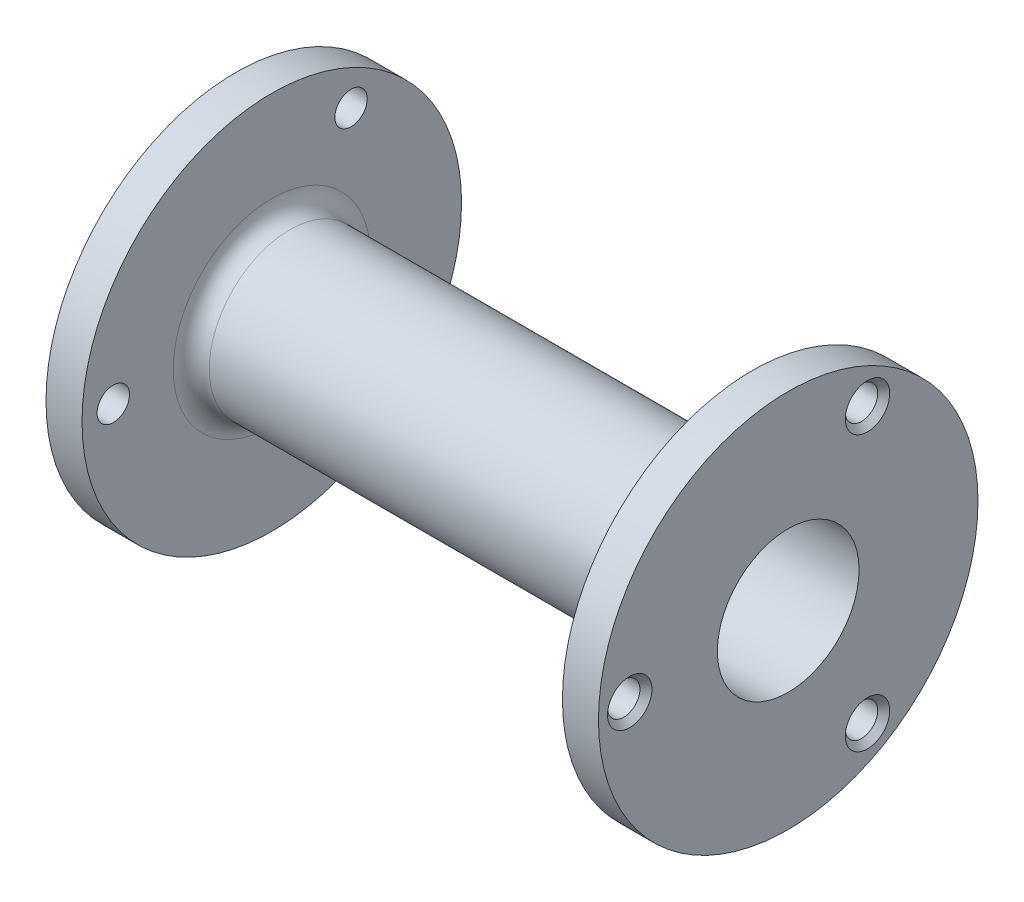
ISO-10303-21;
HEADER;
FILE_DESCRIPTION(('STEP AP214'),'2;1');
FILE_NAME('part.step','',(''),(''),'','','');
FILE_SCHEMA(('AUTOMOTIVE_DESIGN { 1 0 10303 214 1 1 1 1 }'));
ENDSEC;
DATA;
#1=APPLICATION_CONTEXT('core data for automotive mechanical design processes');
#2=APPLICATION_PROTOCOL_DEFINITION('international standard','automotive_design',2000,#1);
#3=PRODUCT_CONTEXT('',#1,'mechanical');
#4=PRODUCT('Part','Part','',(#3));
#5=PRODUCT_RELATED_PRODUCT_CATEGORY('part','',(#4));
#6=PRODUCT_DEFINITION_FORMATION('','',#4);
#7=PRODUCT_DEFINITION_CONTEXT('part definition',#1,'design');
#8=PRODUCT_DEFINITION('design','',#6,#7);
#9=PRODUCT_DEFINITION_SHAPE('','',#8);
#10=(LENGTH_UNIT() NAMED_UNIT(*) SI_UNIT(.MILLI.,.METRE.));
#11=(NAMED_UNIT(*) PLANE_ANGLE_UNIT() SI_UNIT($,.RADIAN.));
#12=(NAMED_UNIT(*) SI_UNIT($,.STERADIAN.) SOLID_ANGLE_UNIT());
#13=UNCERTAINTY_MEASURE_WITH_UNIT(LENGTH_MEASURE(1.E-05),#10,'distance_accuracy_value','');
#14=(GEOMETRIC_REPRESENTATION_CONTEXT(3) GLOBAL_UNCERTAINTY_ASSIGNED_CONTEXT((#13)) GLOBAL_UNIT_ASSIGNED_CONTEXT((#10,
#11,#12)) REPRESENTATION_CONTEXT('',''));
#15=CARTESIAN_POINT('',(0.,0.,0.));
#16=DIRECTION('',(0.,0.,1.));
#17=DIRECTION('',(1.,0.,0.));
#18=AXIS2_PLACEMENT_3D('',#15,#16,#17);
#19=CARTESIAN_POINT('',(0.,0.,0.));
#20=DIRECTION('',(1.,0.,0.));
#21=DIRECTION('',(0.,0.,-1.));
#22=AXIS2_PLACEMENT_3D('',#19,#20,#21);
#23=CYLINDRICAL_SURFACE('',#22,15.8);
#24=CARTESIAN_POINT('',(0.,0.,0.));
#25=DIRECTION('',(1.,0.,0.));
#26=DIRECTION('',(0.,0.,-1.));
#27=AXIS2_PLACEMENT_3D('',#24,#25,#26);
#28=CIRCLE('',#27,15.8);
#29=CARTESIAN_POINT('',(0.,0.,-15.8));
#30=VERTEX_POINT('',#29);
#31=EDGE_CURVE('E104',#30,#30,#28,.T.);
#32=ORIENTED_EDGE('',*,*,#31,.T.);
#33=EDGE_LOOP('',(#32));
#34=FACE_BOUND('',#33,.T.);
#35=CARTESIAN_POINT('',(3.,0.,0.));
#36=DIRECTION('',(1.,0.,0.));
#37=DIRECTION('',(0.,0.,-1.));
#38=AXIS2_PLACEMENT_3D('',#35,#36,#37);
#39=CIRCLE('',#38,15.8);
#40=CARTESIAN_POINT('',(3.,0.,-15.8));
#41=VERTEX_POINT('',#40);
#42=EDGE_CURVE('E77',#41,#41,#39,.T.);
#43=ORIENTED_EDGE('',*,*,#42,.F.);
#44=EDGE_LOOP('',(#43));
#45=FACE_BOUND('',#44,.T.);
#46=ADVANCED_FACE('F33',(#34,#45),#23,.T.);
#47=CARTESIAN_POINT('',(3.,15.8,0.));
#48=DIRECTION('',(1.,0.,0.));
#49=DIRECTION('',(0.,0.,-1.));
#50=AXIS2_PLACEMENT_3D('',#47,#48,#49);
#51=PLANE('',#50);
#52=CARTESIAN_POINT('',(3.,0.,13.2));
#53=DIRECTION('',(1.,0.,0.));
#54=DIRECTION('',(0.,0.,-1.));
#55=AXIS2_PLACEMENT_3D('',#52,#53,#54);
#56=CIRCLE('',#55,1.35);
#57=CARTESIAN_POINT('',(3.,0.,11.85));
#58=VERTEX_POINT('',#57);
#59=EDGE_CURVE('E107',#58,#58,#56,.T.);
#60=ORIENTED_EDGE('',*,*,#59,.F.);
#61=EDGE_LOOP('',(#60));
#62=FACE_BOUND('',#61,.T.);
#63=CARTESIAN_POINT('',(3.,11.4315353299546,-6.60000000000007));
#64=DIRECTION('',(1.,0.,0.));
#65=DIRECTION('',(0.,0.,-1.));
#66=AXIS2_PLACEMENT_3D('',#63,#64,#65);
#67=CIRCLE('',#66,1.35);
#68=CARTESIAN_POINT('',(3.,11.4315353299546,-7.95000000000007));
#69=VERTEX_POINT('',#68);
#70=EDGE_CURVE('E113',#69,#69,#67,.T.);
#71=ORIENTED_EDGE('',*,*,#70,.F.);
#72=EDGE_LOOP('',(#71));
#73=FACE_BOUND('',#72,.T.);
#74=CARTESIAN_POINT('',(3.,-11.4315353299547,-6.60000000000001));
#75=DIRECTION('',(1.,0.,0.));
#76=DIRECTION('',(0.,0.,-1.));
#77=AXIS2_PLACEMENT_3D('',#74,#75,#76);
#78=CIRCLE('',#77,1.35);
#79=CARTESIAN_POINT('',(3.,-11.4315353299547,-7.95000000000001));
#80=VERTEX_POINT('',#79);
#81=EDGE_CURVE('E119',#80,#80,#78,.T.);
#82=ORIENTED_EDGE('',*,*,#81,.F.);
#83=EDGE_LOOP('',(#82));
#84=FACE_BOUND('',#83,.T.);
#85=ORIENTED_EDGE('',*,*,#42,.T.);
#86=EDGE_LOOP('',(#85));
#87=FACE_BOUND('',#86,.T.);
#88=CARTESIAN_POINT('',(3.,0.,0.));
#89=DIRECTION('',(1.,0.,0.));
#90=DIRECTION('',(0.,0.,-1.));
#91=AXIS2_PLACEMENT_3D('',#88,#89,#90);
#92=CIRCLE('',#91,8.21);
#93=CARTESIAN_POINT('',(3.,0.,-8.21));
#94=VERTEX_POINT('',#93);
#95=EDGE_CURVE('E80',#94,#94,#92,.T.);
#96=ORIENTED_EDGE('',*,*,#95,.F.);
#97=EDGE_LOOP('',(#96));
#98=FACE_BOUND('',#97,.T.);
#99=ADVANCED_FACE('F167',(#62,#73,#84,#87,#98),#51,.T.);
#100=CARTESIAN_POINT('',(4.5,0.,0.));
#101=DIRECTION('',(1.,0.,0.));
#102=DIRECTION('',(0.,0.,-1.));
#103=AXIS2_PLACEMENT_3D('',#100,#101,#102);
#104=TOROIDAL_SURFACE('',#103,8.21,1.5);
#105=ORIENTED_EDGE('',*,*,#95,.T.);
#106=EDGE_LOOP('',(#105));
#107=FACE_BOUND('',#106,.T.);
#108=CARTESIAN_POINT('',(4.5,0.,0.));
#109=DIRECTION('',(1.,0.,0.));
#110=DIRECTION('',(0.,0.,-1.));
#111=AXIS2_PLACEMENT_3D('',#108,#109,#110);
#112=CIRCLE('',#111,6.71);
#113=CARTESIAN_POINT('',(4.5,0.,-6.71));
#114=VERTEX_POINT('',#113);
#115=EDGE_CURVE('E83',#114,#114,#112,.T.);
#116=ORIENTED_EDGE('',*,*,#115,.F.);
#117=EDGE_LOOP('',(#116));
#118=FACE_BOUND('',#117,.T.);
#119=ADVANCED_FACE('F173',(#107,#118),#104,.F.);
#120=CARTESIAN_POINT('',(0.,0.,0.));
#121=DIRECTION('',(1.,0.,0.));
#122=DIRECTION('',(0.,0.,-1.));
#123=AXIS2_PLACEMENT_3D('',#120,#121,#122);
#124=CYLINDRICAL_SURFACE('',#123,6.71);
#125=ORIENTED_EDGE('',*,*,#115,.T.);
#126=EDGE_LOOP('',(#125));
#127=FACE_BOUND('',#126,.T.);
#128=CARTESIAN_POINT('',(41.5,0.,0.));
#129=DIRECTION('',(1.,0.,0.));
#130=DIRECTION('',(0.,0.,-1.));
#131=AXIS2_PLACEMENT_3D('',#128,#129,#130);
#132=CIRCLE('',#131,6.71);
#133=CARTESIAN_POINT('',(41.5,0.,-6.71));
#134=VERTEX_POINT('',#133);
#135=EDGE_CURVE('E86',#134,#134,#132,.T.);
#136=ORIENTED_EDGE('',*,*,#135,.F.);
#137=EDGE_LOOP('',(#136));
#138=FACE_BOUND('',#137,.T.);
#139=ADVANCED_FACE('F180',(#127,#138),#124,.T.);
#140=CARTESIAN_POINT('',(41.5,0.,0.));
#141=DIRECTION('',(1.,0.,0.));
#142=DIRECTION('',(0.,0.,-1.));
#143=AXIS2_PLACEMENT_3D('',#140,#141,#142);
#144=TOROIDAL_SURFACE('',#143,8.21,1.5);
#145=ORIENTED_EDGE('',*,*,#135,.T.);
#146=EDGE_LOOP('',(#145));
#147=FACE_BOUND('',#146,.T.);
#148=CARTESIAN_POINT('',(43.,0.,0.));
#149=DIRECTION('',(1.,0.,0.));
#150=DIRECTION('',(0.,0.,-1.));
#151=AXIS2_PLACEMENT_3D('',#148,#149,#150);
#152=CIRCLE('',#151,8.21);
#153=CARTESIAN_POINT('',(43.,0.,-8.21));
#154=VERTEX_POINT('',#153);
#155=EDGE_CURVE('E89',#154,#154,#152,.T.);
#156=ORIENTED_EDGE('',*,*,#155,.F.);
#157=EDGE_LOOP('',(#156));
#158=FACE_BOUND('',#157,.T.);
#159=ADVANCED_FACE('F132',(#147,#158),#144,.F.);
#160=CARTESIAN_POINT('',(43.,8.21,0.));
#161=DIRECTION('',(-1.,0.,0.));
#162=DIRECTION('',(0.,0.,1.));
#163=AXIS2_PLACEMENT_3D('',#160,#161,#162);
#164=PLANE('',#163);
#165=CARTESIAN_POINT('',(43.,0.,13.2));
#166=DIRECTION('',(-1.,0.,0.));
#167=DIRECTION('',(0.,0.,1.));
#168=AXIS2_PLACEMENT_3D('',#165,#166,#167);
#169=CIRCLE('',#168,1.35);
#170=CARTESIAN_POINT('',(43.,0.,14.55));
#171=VERTEX_POINT('',#170);
#172=EDGE_CURVE('E110',#171,#171,#169,.T.);
#173=ORIENTED_EDGE('',*,*,#172,.F.);
#174=EDGE_LOOP('',(#173));
#175=FACE_BOUND('',#174,.T.);
#176=CARTESIAN_POINT('',(43.,11.4315353299546,-6.60000000000007));
#177=DIRECTION('',(-1.,0.,0.));
#178=DIRECTION('',(0.,0.,1.));
#179=AXIS2_PLACEMENT_3D('',#176,#177,#178);
#180=CIRCLE('',#179,1.35);
#181=CARTESIAN_POINT('',(43.,11.4315353299546,-5.25000000000007));
#182=VERTEX_POINT('',#181);
#183=EDGE_CURVE('E116',#182,#182,#180,.T.);
#184=ORIENTED_EDGE('',*,*,#183,.F.);
#185=EDGE_LOOP('',(#184));
#186=FACE_BOUND('',#185,.T.);
#187=CARTESIAN_POINT('',(43.,-11.4315353299547,-6.60000000000001));
#188=DIRECTION('',(-1.,0.,0.));
#189=DIRECTION('',(0.,0.,1.));
#190=AXIS2_PLACEMENT_3D('',#187,#188,#189);
#191=CIRCLE('',#190,1.35);
#192=CARTESIAN_POINT('',(43.,-11.4315353299547,-5.25000000000002));
#193=VERTEX_POINT('',#192);
#194=EDGE_CURVE('E122',#193,#193,#191,.T.);
#195=ORIENTED_EDGE('',*,*,#194,.F.);
#196=EDGE_LOOP('',(#195));
#197=FACE_BOUND('',#196,.T.);
#198=ORIENTED_EDGE('',*,*,#155,.T.);
#199=EDGE_LOOP('',(#198));
#200=FACE_BOUND('',#199,.T.);
#201=CARTESIAN_POINT('',(43.,0.,0.));
#202=DIRECTION('',(1.,0.,0.));
#203=DIRECTION('',(0.,0.,-1.));
#204=AXIS2_PLACEMENT_3D('',#201,#202,#203);
#205=CIRCLE('',#204,15.8);
#206=CARTESIAN_POINT('',(43.,0.,-15.8));
#207=VERTEX_POINT('',#206);
#208=EDGE_CURVE('E92',#207,#207,#205,.T.);
#209=ORIENTED_EDGE('',*,*,#208,.F.);
#210=EDGE_LOOP('',(#209));
#211=FACE_BOUND('',#210,.T.);
#212=ADVANCED_FACE('F128',(#175,#186,#197,#200,#211),#164,.T.);
#213=CARTESIAN_POINT('',(0.,0.,0.));
#214=DIRECTION('',(1.,0.,0.));
#215=DIRECTION('',(0.,0.,-1.));
#216=AXIS2_PLACEMENT_3D('',#213,#214,#215);
#217=CYLINDRICAL_SURFACE('',#216,15.8);
#218=ORIENTED_EDGE('',*,*,#208,.T.);
#219=EDGE_LOOP('',(#218));
#220=FACE_BOUND('',#219,.T.);
#221=CARTESIAN_POINT('',(46.,0.,0.));
#222=DIRECTION('',(1.,0.,0.));
#223=DIRECTION('',(0.,0.,-1.));
#224=AXIS2_PLACEMENT_3D('',#221,#222,#223);
#225=CIRCLE('',#224,15.8);
#226=CARTESIAN_POINT('',(46.,0.,-15.8));
#227=VERTEX_POINT('',#226);
#228=EDGE_CURVE('E95',#227,#227,#225,.T.);
#229=ORIENTED_EDGE('',*,*,#228,.F.);
#230=EDGE_LOOP('',(#229));
#231=FACE_BOUND('',#230,.T.);
#232=ADVANCED_FACE('F131',(#220,#231),#217,.T.);
#233=CARTESIAN_POINT('',(46.,15.8,0.));
#234=DIRECTION('',(1.,0.,0.));
#235=DIRECTION('',(0.,0.,-1.));
#236=AXIS2_PLACEMENT_3D('',#233,#234,#235);
#237=PLANE('',#236);
#238=CARTESIAN_POINT('',(46.,0.,13.2));
#239=DIRECTION('',(1.,0.,0.));
#240=DIRECTION('',(0.,0.,-1.));
#241=AXIS2_PLACEMENT_3D('',#238,#239,#240);
#242=CIRCLE('',#241,1.85000000000001);
#243=CARTESIAN_POINT('',(46.,0.,11.35));
#244=VERTEX_POINT('',#243);
#245=EDGE_CURVE('E44',#244,#244,#242,.F.);
#246=ORIENTED_EDGE('',*,*,#245,.T.);
#247=EDGE_LOOP('',(#246));
#248=FACE_BOUND('',#247,.T.);
#249=CARTESIAN_POINT('',(46.,-11.4315353299547,-6.60000000000001));
#250=DIRECTION('',(1.,0.,0.));
#251=DIRECTION('',(0.,0.,-1.));
#252=AXIS2_PLACEMENT_3D('',#249,#250,#251);
#253=CIRCLE('',#252,1.85);
#254=CARTESIAN_POINT('',(46.,-11.4315353299547,-8.45000000000002));
#255=VERTEX_POINT('',#254);
#256=EDGE_CURVE('E48',#255,#255,#253,.F.);
#257=ORIENTED_EDGE('',*,*,#256,.T.);
#258=EDGE_LOOP('',(#257));
#259=FACE_BOUND('',#258,.T.);
#260=CARTESIAN_POINT('',(46.,11.4315353299546,-6.60000000000007));
#261=DIRECTION('',(1.,0.,0.));
#262=DIRECTION('',(0.,0.,-1.));
#263=AXIS2_PLACEMENT_3D('',#260,#261,#262);
#264=CIRCLE('',#263,1.85);
#265=CARTESIAN_POINT('',(46.,11.4315353299546,-8.45000000000007));
#266=VERTEX_POINT('',#265);
#267=EDGE_CURVE('E53',#266,#266,#264,.F.);
#268=ORIENTED_EDGE('',*,*,#267,.T.);
#269=EDGE_LOOP('',(#268));
#270=FACE_BOUND('',#269,.T.);
#271=ORIENTED_EDGE('',*,*,#228,.T.);
#272=EDGE_LOOP('',(#271));
#273=FACE_BOUND('',#272,.T.);
#274=CARTESIAN_POINT('',(46.,0.,0.));
#275=DIRECTION('',(1.,0.,0.));
#276=DIRECTION('',(0.,0.,-1.));
#277=AXIS2_PLACEMENT_3D('',#274,#275,#276);
#278=CIRCLE('',#277,5.9);
#279=CARTESIAN_POINT('',(46.,0.,-5.9));
#280=VERTEX_POINT('',#279);
#281=EDGE_CURVE('E98',#280,#280,#278,.T.);
#282=ORIENTED_EDGE('',*,*,#281,.F.);
#283=EDGE_LOOP('',(#282));
#284=FACE_BOUND('',#283,.T.);
#285=ADVANCED_FACE('F141',(#248,#259,#270,#273,#284),#237,.T.);
#286=CARTESIAN_POINT('',(0.,0.,0.));
#287=DIRECTION('',(1.,0.,0.));
#288=DIRECTION('',(0.,0.,-1.));
#289=AXIS2_PLACEMENT_3D('',#286,#287,#288);
#290=CYLINDRICAL_SURFACE('',#289,5.9);
#291=ORIENTED_EDGE('',*,*,#281,.T.);
#292=EDGE_LOOP('',(#291));
#293=FACE_BOUND('',#292,.T.);
#294=CARTESIAN_POINT('',(0.,0.,0.));
#295=DIRECTION('',(1.,0.,0.));
#296=DIRECTION('',(0.,0.,-1.));
#297=AXIS2_PLACEMENT_3D('',#294,#295,#296);
#298=CIRCLE('',#297,5.9);
#299=CARTESIAN_POINT('',(0.,0.,-5.9));
#300=VERTEX_POINT('',#299);
#301=EDGE_CURVE('E101',#300,#300,#298,.T.);
#302=ORIENTED_EDGE('',*,*,#301,.F.);
#303=EDGE_LOOP('',(#302));
#304=FACE_BOUND('',#303,.T.);
#305=ADVANCED_FACE('F147',(#293,#304),#290,.F.);
#306=CARTESIAN_POINT('',(0.,5.9,0.));
#307=DIRECTION('',(-1.,0.,0.));
#308=DIRECTION('',(0.,0.,1.));
#309=AXIS2_PLACEMENT_3D('',#306,#307,#308);
#310=PLANE('',#309);
#311=CARTESIAN_POINT('',(0.,-11.4315353299547,-6.60000000000001));
#312=DIRECTION('',(-1.,0.,0.));
#313=DIRECTION('',(0.,0.,1.));
#314=AXIS2_PLACEMENT_3D('',#311,#312,#313);
#315=CIRCLE('',#314,1.84999999999999);
#316=CARTESIAN_POINT('',(0.,-11.4315353299547,-4.75000000000002));
#317=VERTEX_POINT('',#316);
#318=EDGE_CURVE('E68',#317,#317,#315,.F.);
#319=ORIENTED_EDGE('',*,*,#318,.T.);
#320=EDGE_LOOP('',(#319));
#321=FACE_BOUND('',#320,.T.);
#322=CARTESIAN_POINT('',(0.,11.4315353299546,-6.60000000000007));
#323=DIRECTION('',(-1.,0.,0.));
#324=DIRECTION('',(0.,0.,1.));
#325=AXIS2_PLACEMENT_3D('',#322,#323,#324);
#326=CIRCLE('',#325,1.84999999999999);
#327=CARTESIAN_POINT('',(0.,11.4315353299546,-4.75000000000008));
#328=VERTEX_POINT('',#327);
#329=EDGE_CURVE('E71',#328,#328,#326,.F.);
#330=ORIENTED_EDGE('',*,*,#329,.T.);
#331=EDGE_LOOP('',(#330));
#332=FACE_BOUND('',#331,.T.);
#333=CARTESIAN_POINT('',(0.,0.,13.2));
#334=DIRECTION('',(-1.,0.,0.));
#335=DIRECTION('',(0.,0.,1.));
#336=AXIS2_PLACEMENT_3D('',#333,#334,#335);
#337=CIRCLE('',#336,1.85);
#338=CARTESIAN_POINT('',(0.,0.,15.05));
#339=VERTEX_POINT('',#338);
#340=EDGE_CURVE('E74',#339,#339,#337,.F.);
#341=ORIENTED_EDGE('',*,*,#340,.T.);
#342=EDGE_LOOP('',(#341));
#343=FACE_BOUND('',#342,.T.);
#344=ORIENTED_EDGE('',*,*,#301,.T.);
#345=EDGE_LOOP('',(#344));
#346=FACE_BOUND('',#345,.T.);
#347=ORIENTED_EDGE('',*,*,#31,.F.);
#348=EDGE_LOOP('',(#347));
#349=FACE_BOUND('',#348,.T.);
#350=ADVANCED_FACE('F154',(#321,#332,#343,#346,#349),#310,.T.);
#351=CARTESIAN_POINT('',(0.,-11.4315353299547,-6.60000000000001));
#352=DIRECTION('',(1.,0.,0.));
#353=DIRECTION('',(0.,0.,-1.));
#354=AXIS2_PLACEMENT_3D('',#351,#352,#353);
#355=CYLINDRICAL_SURFACE('',#354,1.35);
#356=CARTESIAN_POINT('',(0.499999999999986,-11.4315353299547,-6.60000000000001));
#357=DIRECTION('',(-1.,0.,0.));
#358=DIRECTION('',(0.,0.,1.));
#359=AXIS2_PLACEMENT_3D('',#356,#357,#358);
#360=CIRCLE('',#359,1.35);
#361=CARTESIAN_POINT('',(0.499999999999986,-11.4315353299547,-5.25000000000002));
#362=VERTEX_POINT('',#361);
#363=EDGE_CURVE('E65',#362,#362,#360,.T.);
#364=ORIENTED_EDGE('',*,*,#363,.T.);
#365=EDGE_LOOP('',(#364));
#366=FACE_BOUND('',#365,.T.);
#367=ORIENTED_EDGE('',*,*,#81,.T.);
#368=EDGE_LOOP('',(#367));
#369=FACE_BOUND('',#368,.T.);
#370=ADVANCED_FACE('F160',(#366,#369),#355,.F.);
#371=CARTESIAN_POINT('',(0.,11.4315353299546,-6.60000000000007));
#372=DIRECTION('',(1.,0.,0.));
#373=DIRECTION('',(0.,0.,-1.));
#374=AXIS2_PLACEMENT_3D('',#371,#372,#373);
#375=CYLINDRICAL_SURFACE('',#374,1.35);
#376=CARTESIAN_POINT('',(0.499999999999986,11.4315353299546,-6.60000000000007));
#377=DIRECTION('',(-1.,0.,0.));
#378=DIRECTION('',(0.,0.,1.));
#379=AXIS2_PLACEMENT_3D('',#376,#377,#378);
#380=CIRCLE('',#379,1.35);
#381=CARTESIAN_POINT('',(0.499999999999986,11.4315353299546,-5.25000000000007));
#382=VERTEX_POINT('',#381);
#383=EDGE_CURVE('E62',#382,#382,#380,.T.);
#384=ORIENTED_EDGE('',*,*,#383,.T.);
#385=EDGE_LOOP('',(#384));
#386=FACE_BOUND('',#385,.T.);
#387=ORIENTED_EDGE('',*,*,#70,.T.);
#388=EDGE_LOOP('',(#387));
#389=FACE_BOUND('',#388,.T.);
#390=ADVANCED_FACE('F275',(#386,#389),#375,.F.);
#391=CARTESIAN_POINT('',(0.,0.,13.2));
#392=DIRECTION('',(1.,0.,0.));
#393=DIRECTION('',(0.,0.,-1.));
#394=AXIS2_PLACEMENT_3D('',#391,#392,#393);
#395=CYLINDRICAL_SURFACE('',#394,1.35);
#396=CARTESIAN_POINT('',(0.499999999999992,0.,13.2));
#397=DIRECTION('',(-1.,0.,0.));
#398=DIRECTION('',(0.,0.,1.));
#399=AXIS2_PLACEMENT_3D('',#396,#397,#398);
#400=CIRCLE('',#399,1.35);
#401=CARTESIAN_POINT('',(0.499999999999992,0.,14.55));
#402=VERTEX_POINT('',#401);
#403=EDGE_CURVE('E59',#402,#402,#400,.T.);
#404=ORIENTED_EDGE('',*,*,#403,.T.);
#405=EDGE_LOOP('',(#404));
#406=FACE_BOUND('',#405,.T.);
#407=ORIENTED_EDGE('',*,*,#59,.T.);
#408=EDGE_LOOP('',(#407));
#409=FACE_BOUND('',#408,.T.);
#410=ADVANCED_FACE('F266',(#406,#409),#395,.F.);
#411=CARTESIAN_POINT('',(45.5,-11.4315353299547,-6.60000000000001));
#412=DIRECTION('',(1.,0.,0.));
#413=DIRECTION('',(0.,0.,-1.));
#414=AXIS2_PLACEMENT_3D('',#411,#412,#413);
#415=CIRCLE('',#414,1.35);
#416=CARTESIAN_POINT('',(45.5,-11.4315353299547,-7.95000000000001));
#417=VERTEX_POINT('',#416);
#418=EDGE_CURVE('E40',#417,#417,#415,.T.);
#419=ORIENTED_EDGE('',*,*,#418,.T.);
#420=EDGE_LOOP('',(#419));
#421=FACE_BOUND('',#420,.T.);
#422=ORIENTED_EDGE('',*,*,#194,.T.);
#423=EDGE_LOOP('',(#422));
#424=FACE_BOUND('',#423,.T.);
#425=ADVANCED_FACE('F126',(#421,#424),#355,.F.);
#426=CARTESIAN_POINT('',(45.5,11.4315353299546,-6.60000000000007));
#427=DIRECTION('',(1.,0.,0.));
#428=DIRECTION('',(0.,0.,-1.));
#429=AXIS2_PLACEMENT_3D('',#426,#427,#428);
#430=CIRCLE('',#429,1.35);
#431=CARTESIAN_POINT('',(45.5,11.4315353299546,-7.95000000000007));
#432=VERTEX_POINT('',#431);
#433=EDGE_CURVE('E10',#432,#432,#430,.T.);
#434=ORIENTED_EDGE('',*,*,#433,.T.);
#435=EDGE_LOOP('',(#434));
#436=FACE_BOUND('',#435,.T.);
#437=ORIENTED_EDGE('',*,*,#183,.T.);
#438=EDGE_LOOP('',(#437));
#439=FACE_BOUND('',#438,.T.);
#440=ADVANCED_FACE('F263',(#436,#439),#375,.F.);
#441=CARTESIAN_POINT('',(45.5,0.,13.2));
#442=DIRECTION('',(1.,0.,0.));
#443=DIRECTION('',(0.,0.,-1.));
#444=AXIS2_PLACEMENT_3D('',#441,#442,#443);
#445=CIRCLE('',#444,1.35);
#446=CARTESIAN_POINT('',(45.5,0.,11.85));
#447=VERTEX_POINT('',#446);
#448=EDGE_CURVE('E56',#447,#447,#445,.T.);
#449=ORIENTED_EDGE('',*,*,#448,.T.);
#450=EDGE_LOOP('',(#449));
#451=FACE_BOUND('',#450,.T.);
#452=ORIENTED_EDGE('',*,*,#172,.T.);
#453=EDGE_LOOP('',(#452));
#454=FACE_BOUND('',#453,.T.);
#455=ADVANCED_FACE('F199',(#451,#454),#395,.F.);
#456=CARTESIAN_POINT('',(0.,-11.4315353299547,-6.60000000000001));
#457=DIRECTION('',(-1.,0.,0.));
#458=DIRECTION('',(0.,0.,1.));
#459=AXIS2_PLACEMENT_3D('',#456,#457,#458);
#460=CONICAL_SURFACE('',#459,1.84999999999999,0.785398163397453);
#461=ORIENTED_EDGE('',*,*,#363,.F.);
#462=EDGE_LOOP('',(#461));
#463=FACE_BOUND('',#462,.T.);
#464=ORIENTED_EDGE('',*,*,#318,.F.);
#465=EDGE_LOOP('',(#464));
#466=FACE_BOUND('',#465,.T.);
#467=ADVANCED_FACE('F195',(#463,#466),#460,.F.);
#468=CARTESIAN_POINT('',(0.,11.4315353299546,-6.60000000000007));
#469=DIRECTION('',(-1.,0.,0.));
#470=DIRECTION('',(0.,0.,1.));
#471=AXIS2_PLACEMENT_3D('',#468,#469,#470);
#472=CONICAL_SURFACE('',#471,1.84999999999999,0.785398163397453);
#473=ORIENTED_EDGE('',*,*,#383,.F.);
#474=EDGE_LOOP('',(#473));
#475=FACE_BOUND('',#474,.T.);
#476=ORIENTED_EDGE('',*,*,#329,.F.);
#477=EDGE_LOOP('',(#476));
#478=FACE_BOUND('',#477,.T.);
#479=ADVANCED_FACE('F198',(#475,#478),#472,.F.);
#480=CARTESIAN_POINT('',(0.,0.,13.2));
#481=DIRECTION('',(-1.,0.,0.));
#482=DIRECTION('',(0.,0.,1.));
#483=AXIS2_PLACEMENT_3D('',#480,#481,#482);
#484=CONICAL_SURFACE('',#483,1.85,0.785398163397453);
#485=ORIENTED_EDGE('',*,*,#403,.F.);
#486=EDGE_LOOP('',(#485));
#487=FACE_BOUND('',#486,.T.);
#488=ORIENTED_EDGE('',*,*,#340,.F.);
#489=EDGE_LOOP('',(#488));
#490=FACE_BOUND('',#489,.T.);
#491=ADVANCED_FACE('F203',(#487,#490),#484,.F.);
#492=CARTESIAN_POINT('',(45.5,0.,13.2));
#493=DIRECTION('',(1.,0.,0.));
#494=DIRECTION('',(0.,0.,-1.));
#495=AXIS2_PLACEMENT_3D('',#492,#493,#494);
#496=CONICAL_SURFACE('',#495,1.35,0.785398163397452);
#497=ORIENTED_EDGE('',*,*,#245,.F.);
#498=EDGE_LOOP('',(#497));
#499=FACE_BOUND('',#498,.T.);
#500=ORIENTED_EDGE('',*,*,#448,.F.);
#501=EDGE_LOOP('',(#500));
#502=FACE_BOUND('',#501,.T.);
#503=ADVANCED_FACE('F207',(#499,#502),#496,.F.);
#504=CARTESIAN_POINT('',(45.5,-11.4315353299547,-6.60000000000001));
#505=DIRECTION('',(1.,0.,0.));
#506=DIRECTION('',(0.,0.,-1.));
#507=AXIS2_PLACEMENT_3D('',#504,#505,#506);
#508=CONICAL_SURFACE('',#507,1.35,0.785398163397453);
#509=ORIENTED_EDGE('',*,*,#256,.F.);
#510=EDGE_LOOP('',(#509));
#511=FACE_BOUND('',#510,.T.);
#512=ORIENTED_EDGE('',*,*,#418,.F.);
#513=EDGE_LOOP('',(#512));
#514=FACE_BOUND('',#513,.T.);
#515=ADVANCED_FACE('F210',(#511,#514),#508,.F.);
#516=CARTESIAN_POINT('',(45.5,11.4315353299546,-6.60000000000007));
#517=DIRECTION('',(1.,0.,0.));
#518=DIRECTION('',(0.,0.,-1.));
#519=AXIS2_PLACEMENT_3D('',#516,#517,#518);
#520=CONICAL_SURFACE('',#519,1.35,0.785398163397453);
#521=ORIENTED_EDGE('',*,*,#267,.F.);
#522=EDGE_LOOP('',(#521));
#523=FACE_BOUND('',#522,.T.);
#524=ORIENTED_EDGE('',*,*,#433,.F.);
#525=EDGE_LOOP('',(#524));
#526=FACE_BOUND('',#525,.T.);
#527=ADVANCED_FACE('F35',(#523,#526),#520,.F.);
#528=CLOSED_SHELL('',(#46,#99,#119,#139,#159,#212,#232,#285,#305,#350,#370,#390,#410,#425,#440,
#455,#467,#479,#491,#503,#515,#527));
#529=MANIFOLD_SOLID_BREP('B2',#528);
#530=ADVANCED_BREP_SHAPE_REPRESENTATION('',(#18,#529),#14);
#531=SHAPE_DEFINITION_REPRESENTATION(#9,#530);
ENDSEC;
END-ISO-10303-21;
